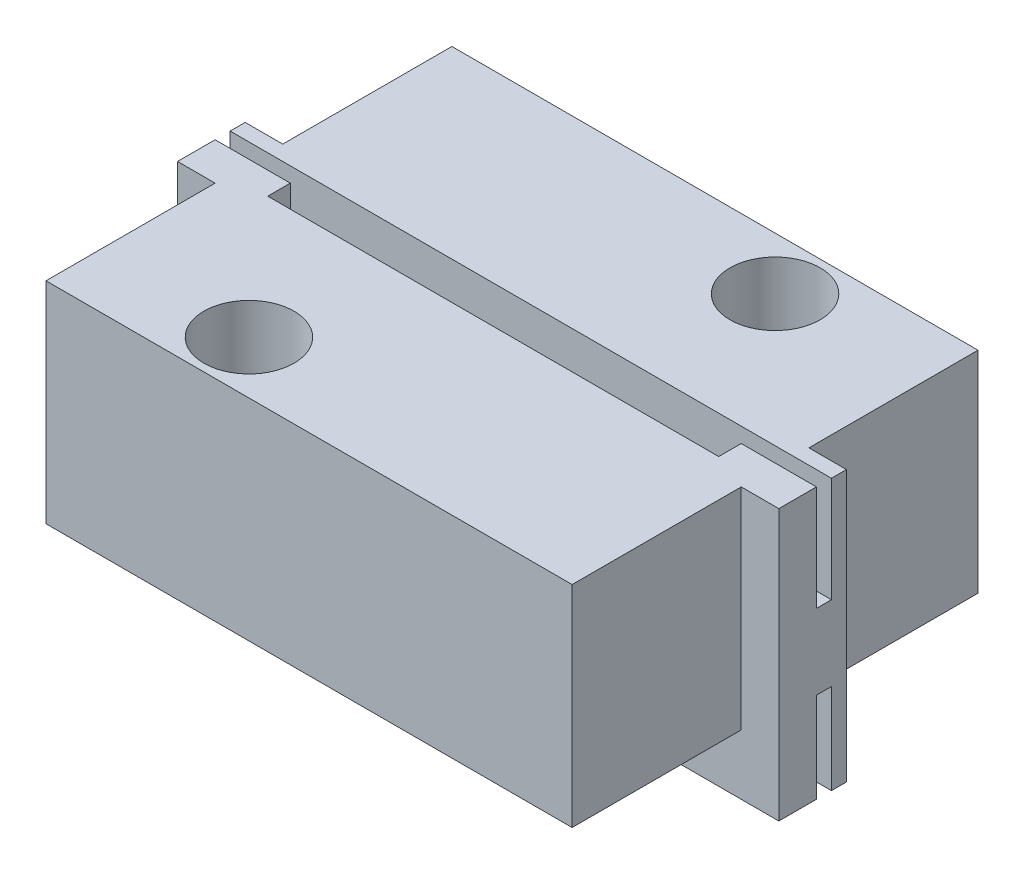
ISO-10303-21;
HEADER;
FILE_DESCRIPTION(('STEP AP214'),'2;1');
FILE_NAME('part.step','',(''),(''),'','','');
FILE_SCHEMA(('AUTOMOTIVE_DESIGN { 1 0 10303 214 1 1 1 1 }'));
ENDSEC;
DATA;
#1=APPLICATION_CONTEXT('core data for automotive mechanical design processes');
#2=APPLICATION_PROTOCOL_DEFINITION('international standard','automotive_design',2000,#1);
#3=PRODUCT_CONTEXT('',#1,'mechanical');
#4=PRODUCT('Part','Part','',(#3));
#5=PRODUCT_RELATED_PRODUCT_CATEGORY('part','',(#4));
#6=PRODUCT_DEFINITION_FORMATION('','',#4);
#7=PRODUCT_DEFINITION_CONTEXT('part definition',#1,'design');
#8=PRODUCT_DEFINITION('design','',#6,#7);
#9=PRODUCT_DEFINITION_SHAPE('','',#8);
#10=(LENGTH_UNIT() NAMED_UNIT(*) SI_UNIT(.MILLI.,.METRE.));
#11=(NAMED_UNIT(*) PLANE_ANGLE_UNIT() SI_UNIT($,.RADIAN.));
#12=(NAMED_UNIT(*) SI_UNIT($,.STERADIAN.) SOLID_ANGLE_UNIT());
#13=UNCERTAINTY_MEASURE_WITH_UNIT(LENGTH_MEASURE(1.E-05),#10,'distance_accuracy_value','');
#14=(GEOMETRIC_REPRESENTATION_CONTEXT(3) GLOBAL_UNCERTAINTY_ASSIGNED_CONTEXT((#13)) GLOBAL_UNIT_ASSIGNED_CONTEXT((#10,
#11,#12)) REPRESENTATION_CONTEXT('',''));
#15=CARTESIAN_POINT('',(0.,0.,0.));
#16=DIRECTION('',(0.,0.,1.));
#17=DIRECTION('',(1.,0.,0.));
#18=AXIS2_PLACEMENT_3D('',#15,#16,#17);
#19=CARTESIAN_POINT('',(20.,7.,1.25));
#20=DIRECTION('',(0.,0.,1.));
#21=DIRECTION('',(1.,0.,0.));
#22=AXIS2_PLACEMENT_3D('',#19,#20,#21);
#23=PLANE('',#22);
#24=DIRECTION('',(0.,-1.,0.));
#25=VECTOR('',#24,1.);
#26=CARTESIAN_POINT('',(-15.,7.,1.25));
#27=LINE('',#26,#25);
#28=CARTESIAN_POINT('',(-15.,14.,1.25));
#29=VERTEX_POINT('',#28);
#30=CARTESIAN_POINT('',(-15.,7.,1.25));
#31=VERTEX_POINT('',#30);
#32=EDGE_CURVE('E256',#29,#31,#27,.T.);
#33=ORIENTED_EDGE('',*,*,#32,.F.);
#34=DIRECTION('',(1.,0.,0.));
#35=VECTOR('',#34,1.);
#36=CARTESIAN_POINT('',(20.,14.,1.25));
#37=LINE('',#36,#35);
#38=CARTESIAN_POINT('',(15.,14.,1.25));
#39=VERTEX_POINT('',#38);
#40=EDGE_CURVE('E295',#29,#39,#37,.T.);
#41=ORIENTED_EDGE('',*,*,#40,.T.);
#42=DIRECTION('',(0.,1.,0.));
#43=VECTOR('',#42,1.);
#44=CARTESIAN_POINT('',(15.,7.,1.25));
#45=LINE('',#44,#43);
#46=CARTESIAN_POINT('',(15.,7.,1.25));
#47=VERTEX_POINT('',#46);
#48=EDGE_CURVE('E270',#47,#39,#45,.T.);
#49=ORIENTED_EDGE('',*,*,#48,.F.);
#50=DIRECTION('',(1.,0.,0.));
#51=VECTOR('',#50,1.);
#52=CARTESIAN_POINT('',(20.,7.,1.25));
#53=LINE('',#52,#51);
#54=EDGE_CURVE('E299',#31,#47,#53,.T.);
#55=ORIENTED_EDGE('',*,*,#54,.F.);
#56=EDGE_LOOP('',(#33,#41,#49,#55));
#57=FACE_BOUND('',#56,.T.);
#58=ADVANCED_FACE('F39',(#57),#23,.F.);
#59=CARTESIAN_POINT('',(0.,7.,0.));
#60=DIRECTION('',(0.,1.,0.));
#61=DIRECTION('',(0.,0.,1.));
#62=AXIS2_PLACEMENT_3D('',#59,#60,#61);
#63=PLANE('',#62);
#64=DIRECTION('',(-1.,0.,0.));
#65=VECTOR('',#64,1.);
#66=CARTESIAN_POINT('',(-20.,7.,-0.25));
#67=LINE('',#66,#65);
#68=CARTESIAN_POINT('',(-15.,7.,-0.25));
#69=VERTEX_POINT('',#68);
#70=CARTESIAN_POINT('',(-20.,7.,-0.25));
#71=VERTEX_POINT('',#70);
#72=EDGE_CURVE('E57',#69,#71,#67,.T.);
#73=ORIENTED_EDGE('',*,*,#72,.F.);
#74=DIRECTION('',(0.,0.,1.));
#75=VECTOR('',#74,1.);
#76=CARTESIAN_POINT('',(-15.,7.,-0.25));
#77=LINE('',#76,#75);
#78=EDGE_CURVE('E62',#69,#31,#77,.T.);
#79=ORIENTED_EDGE('',*,*,#78,.T.);
#80=ORIENTED_EDGE('',*,*,#54,.T.);
#81=DIRECTION('',(0.,0.,1.));
#82=VECTOR('',#81,1.);
#83=CARTESIAN_POINT('',(15.,7.,-0.25));
#84=LINE('',#83,#82);
#85=CARTESIAN_POINT('',(15.,7.,-0.25));
#86=VERTEX_POINT('',#85);
#87=EDGE_CURVE('E291',#86,#47,#84,.T.);
#88=ORIENTED_EDGE('',*,*,#87,.F.);
#89=DIRECTION('',(-1.,0.,0.));
#90=VECTOR('',#89,1.);
#91=CARTESIAN_POINT('',(20.,7.,-0.25));
#92=LINE('',#91,#90);
#93=CARTESIAN_POINT('',(20.,7.,-0.25));
#94=VERTEX_POINT('',#93);
#95=EDGE_CURVE('E274',#94,#86,#92,.T.);
#96=ORIENTED_EDGE('',*,*,#95,.F.);
#97=DIRECTION('',(0.,0.,-1.));
#98=VECTOR('',#97,1.);
#99=CARTESIAN_POINT('',(20.,7.,1.25));
#100=LINE('',#99,#98);
#101=CARTESIAN_POINT('',(20.,7.,-1.25));
#102=VERTEX_POINT('',#101);
#103=EDGE_CURVE('E303',#94,#102,#100,.T.);
#104=ORIENTED_EDGE('',*,*,#103,.T.);
#105=DIRECTION('',(-1.,0.,0.));
#106=VECTOR('',#105,1.);
#107=CARTESIAN_POINT('',(20.,7.,-1.25));
#108=LINE('',#107,#106);
#109=CARTESIAN_POINT('',(-20.,7.,-1.25));
#110=VERTEX_POINT('',#109);
#111=EDGE_CURVE('E306',#102,#110,#108,.T.);
#112=ORIENTED_EDGE('',*,*,#111,.T.);
#113=DIRECTION('',(0.,0.,1.));
#114=VECTOR('',#113,1.);
#115=CARTESIAN_POINT('',(-20.,7.,1.25));
#116=LINE('',#115,#114);
#117=EDGE_CURVE('E296',#110,#71,#116,.T.);
#118=ORIENTED_EDGE('',*,*,#117,.T.);
#119=EDGE_LOOP('',(#73,#79,#80,#88,#96,#104,#112,#118));
#120=FACE_BOUND('',#119,.T.);
#121=ADVANCED_FACE('F569',(#120),#63,.T.);
#122=CARTESIAN_POINT('',(0.,14.,0.));
#123=DIRECTION('',(0.,1.,0.));
#124=DIRECTION('',(0.,0.,1.));
#125=AXIS2_PLACEMENT_3D('',#122,#123,#124);
#126=PLANE('',#125);
#127=DIRECTION('',(-1.,0.,0.));
#128=VECTOR('',#127,1.);
#129=CARTESIAN_POINT('',(20.,14.,-1.25));
#130=LINE('',#129,#128);
#131=CARTESIAN_POINT('',(20.,14.,-1.25));
#132=VERTEX_POINT('',#131);
#133=CARTESIAN_POINT('',(-20.,14.,-1.25));
#134=VERTEX_POINT('',#133);
#135=EDGE_CURVE('E300',#132,#134,#130,.T.);
#136=ORIENTED_EDGE('',*,*,#135,.F.);
#137=DIRECTION('',(0.,0.,1.));
#138=VECTOR('',#137,1.);
#139=CARTESIAN_POINT('',(20.,14.,2.25));
#140=LINE('',#139,#138);
#141=CARTESIAN_POINT('',(20.,14.,-2.25));
#142=VERTEX_POINT('',#141);
#143=EDGE_CURVE('E376',#142,#132,#140,.T.);
#144=ORIENTED_EDGE('',*,*,#143,.F.);
#145=DIRECTION('',(-1.,0.,0.));
#146=VECTOR('',#145,1.);
#147=CARTESIAN_POINT('',(20.,14.,-2.25));
#148=LINE('',#147,#146);
#149=CARTESIAN_POINT('',(17.5,14.,-2.25));
#150=VERTEX_POINT('',#149);
#151=EDGE_CURVE('E401',#142,#150,#148,.T.);
#152=ORIENTED_EDGE('',*,*,#151,.T.);
#153=DIRECTION('',(0.,0.,-1.));
#154=VECTOR('',#153,1.);
#155=CARTESIAN_POINT('',(17.5,14.,-13.5));
#156=LINE('',#155,#154);
#157=CARTESIAN_POINT('',(17.5,14.,-13.5));
#158=VERTEX_POINT('',#157);
#159=EDGE_CURVE('E500',#150,#158,#156,.T.);
#160=ORIENTED_EDGE('',*,*,#159,.T.);
#161=DIRECTION('',(-1.,0.,0.));
#162=VECTOR('',#161,1.);
#163=CARTESIAN_POINT('',(-17.5,14.,-13.5));
#164=LINE('',#163,#162);
#165=CARTESIAN_POINT('',(-17.5,14.,-13.5));
#166=VERTEX_POINT('',#165);
#167=EDGE_CURVE('E499',#158,#166,#164,.T.);
#168=ORIENTED_EDGE('',*,*,#167,.T.);
#169=DIRECTION('',(0.,0.,1.));
#170=VECTOR('',#169,1.);
#171=CARTESIAN_POINT('',(-17.5,14.,-13.5));
#172=LINE('',#171,#170);
#173=CARTESIAN_POINT('',(-17.5,14.,-2.25));
#174=VERTEX_POINT('',#173);
#175=EDGE_CURVE('E504',#166,#174,#172,.T.);
#176=ORIENTED_EDGE('',*,*,#175,.T.);
#177=DIRECTION('',(1.,0.,0.));
#178=VECTOR('',#177,1.);
#179=CARTESIAN_POINT('',(-20.,14.,-2.25));
#180=LINE('',#179,#178);
#181=CARTESIAN_POINT('',(-20.,14.,-2.25));
#182=VERTEX_POINT('',#181);
#183=EDGE_CURVE('E426',#182,#174,#180,.T.);
#184=ORIENTED_EDGE('',*,*,#183,.F.);
#185=DIRECTION('',(0.,0.,-1.));
#186=VECTOR('',#185,1.);
#187=CARTESIAN_POINT('',(-20.,14.,2.25));
#188=LINE('',#187,#186);
#189=EDGE_CURVE('E240',#134,#182,#188,.T.);
#190=ORIENTED_EDGE('',*,*,#189,.F.);
#191=EDGE_LOOP('',(#136,#144,#152,#160,#168,#176,#184,#190));
#192=FACE_BOUND('',#191,.T.);
#193=CARTESIAN_POINT('',(7.5,14.,-10.));
#194=DIRECTION('',(0.,1.,0.));
#195=DIRECTION('',(0.,0.,1.));
#196=AXIS2_PLACEMENT_3D('',#193,#194,#195);
#197=CIRCLE('',#196,3.);
#198=CARTESIAN_POINT('',(7.5,14.,-7.));
#199=VERTEX_POINT('',#198);
#200=EDGE_CURVE('E463',#199,#199,#197,.T.);
#201=ORIENTED_EDGE('',*,*,#200,.F.);
#202=EDGE_LOOP('',(#201));
#203=FACE_BOUND('',#202,.T.);
#204=ADVANCED_FACE('F575',(#192,#203),#126,.T.);
#205=CARTESIAN_POINT('',(17.5,2.,1.25));
#206=DIRECTION('',(0.,0.,1.));
#207=DIRECTION('',(1.,0.,0.));
#208=AXIS2_PLACEMENT_3D('',#205,#206,#207);
#209=PLANE('',#208);
#210=DIRECTION('',(0.,-1.,0.));
#211=VECTOR('',#210,1.);
#212=CARTESIAN_POINT('',(-15.,2.,1.25));
#213=LINE('',#212,#211);
#214=CARTESIAN_POINT('',(-15.,2.,1.25));
#215=VERTEX_POINT('',#214);
#216=CARTESIAN_POINT('',(-15.,-4.,1.25));
#217=VERTEX_POINT('',#216);
#218=EDGE_CURVE('E319',#215,#217,#213,.T.);
#219=ORIENTED_EDGE('',*,*,#218,.F.);
#220=DIRECTION('',(-1.,0.,0.));
#221=VECTOR('',#220,1.);
#222=CARTESIAN_POINT('',(17.5,2.,1.25));
#223=LINE('',#222,#221);
#224=CARTESIAN_POINT('',(15.,2.,1.25));
#225=VERTEX_POINT('',#224);
#226=EDGE_CURVE('E445',#225,#215,#223,.T.);
#227=ORIENTED_EDGE('',*,*,#226,.F.);
#228=DIRECTION('',(0.,1.,0.));
#229=VECTOR('',#228,1.);
#230=CARTESIAN_POINT('',(15.,2.,1.25));
#231=LINE('',#230,#229);
#232=CARTESIAN_POINT('',(15.,-4.,1.25));
#233=VERTEX_POINT('',#232);
#234=EDGE_CURVE('E344',#233,#225,#231,.T.);
#235=ORIENTED_EDGE('',*,*,#234,.F.);
#236=DIRECTION('',(-1.,0.,0.));
#237=VECTOR('',#236,1.);
#238=CARTESIAN_POINT('',(17.5,-4.,1.25));
#239=LINE('',#238,#237);
#240=EDGE_CURVE('E446',#233,#217,#239,.T.);
#241=ORIENTED_EDGE('',*,*,#240,.T.);
#242=EDGE_LOOP('',(#219,#227,#235,#241));
#243=FACE_BOUND('',#242,.T.);
#244=ADVANCED_FACE('F606',(#243),#209,.F.);
#245=CARTESIAN_POINT('',(0.,2.,0.));
#246=DIRECTION('',(0.,-1.,0.));
#247=DIRECTION('',(0.,0.,-1.));
#248=AXIS2_PLACEMENT_3D('',#245,#246,#247);
#249=PLANE('',#248);
#250=ORIENTED_EDGE('',*,*,#226,.T.);
#251=DIRECTION('',(0.,0.,1.));
#252=VECTOR('',#251,1.);
#253=CARTESIAN_POINT('',(-15.,2.,-0.25));
#254=LINE('',#253,#252);
#255=CARTESIAN_POINT('',(-15.,2.,-0.25));
#256=VERTEX_POINT('',#255);
#257=EDGE_CURVE('E341',#256,#215,#254,.T.);
#258=ORIENTED_EDGE('',*,*,#257,.F.);
#259=DIRECTION('',(1.,0.,0.));
#260=VECTOR('',#259,1.);
#261=CARTESIAN_POINT('',(-20.,2.,-0.25));
#262=LINE('',#261,#260);
#263=CARTESIAN_POINT('',(-20.,2.,-0.25));
#264=VERTEX_POINT('',#263);
#265=EDGE_CURVE('E325',#264,#256,#262,.T.);
#266=ORIENTED_EDGE('',*,*,#265,.F.);
#267=DIRECTION('',(0.,0.,1.));
#268=VECTOR('',#267,1.);
#269=CARTESIAN_POINT('',(-20.,2.,1.25));
#270=LINE('',#269,#268);
#271=CARTESIAN_POINT('',(-20.,2.,-1.25));
#272=VERTEX_POINT('',#271);
#273=EDGE_CURVE('E414',#272,#264,#270,.T.);
#274=ORIENTED_EDGE('',*,*,#273,.F.);
#275=DIRECTION('',(1.,0.,0.));
#276=VECTOR('',#275,1.);
#277=CARTESIAN_POINT('',(17.5,2.,-1.25));
#278=LINE('',#277,#276);
#279=CARTESIAN_POINT('',(20.,2.,-1.25));
#280=VERTEX_POINT('',#279);
#281=EDGE_CURVE('E441',#272,#280,#278,.T.);
#282=ORIENTED_EDGE('',*,*,#281,.T.);
#283=DIRECTION('',(0.,0.,-1.));
#284=VECTOR('',#283,1.);
#285=CARTESIAN_POINT('',(20.,2.,-1.25));
#286=LINE('',#285,#284);
#287=CARTESIAN_POINT('',(20.,2.,-0.25));
#288=VERTEX_POINT('',#287);
#289=EDGE_CURVE('E387',#288,#280,#286,.T.);
#290=ORIENTED_EDGE('',*,*,#289,.F.);
#291=DIRECTION('',(1.,0.,0.));
#292=VECTOR('',#291,1.);
#293=CARTESIAN_POINT('',(20.,2.,-0.25));
#294=LINE('',#293,#292);
#295=CARTESIAN_POINT('',(15.,2.,-0.25));
#296=VERTEX_POINT('',#295);
#297=EDGE_CURVE('E355',#296,#288,#294,.T.);
#298=ORIENTED_EDGE('',*,*,#297,.F.);
#299=DIRECTION('',(0.,0.,1.));
#300=VECTOR('',#299,1.);
#301=CARTESIAN_POINT('',(15.,2.,-0.25));
#302=LINE('',#301,#300);
#303=EDGE_CURVE('E358',#296,#225,#302,.T.);
#304=ORIENTED_EDGE('',*,*,#303,.T.);
#305=EDGE_LOOP('',(#250,#258,#266,#274,#282,#290,#298,#304));
#306=FACE_BOUND('',#305,.T.);
#307=ADVANCED_FACE('F603',(#306),#249,.T.);
#308=CARTESIAN_POINT('',(17.5,14.,-13.5));
#309=DIRECTION('',(-1.,0.,0.));
#310=DIRECTION('',(0.,0.,1.));
#311=AXIS2_PLACEMENT_3D('',#308,#309,#310);
#312=PLANE('',#311);
#313=DIRECTION('',(0.,-1.,0.));
#314=VECTOR('',#313,1.);
#315=CARTESIAN_POINT('',(17.5,-4.,2.25));
#316=LINE('',#315,#314);
#317=CARTESIAN_POINT('',(17.5,14.,2.25));
#318=VERTEX_POINT('',#317);
#319=CARTESIAN_POINT('',(17.5,0.,2.25));
#320=VERTEX_POINT('',#319);
#321=EDGE_CURVE('E367',#318,#320,#316,.T.);
#322=ORIENTED_EDGE('',*,*,#321,.F.);
#323=CARTESIAN_POINT('',(17.5,14.,13.5));
#324=VERTEX_POINT('',#323);
#325=EDGE_CURVE('E495',#324,#318,#156,.T.);
#326=ORIENTED_EDGE('',*,*,#325,.F.);
#327=DIRECTION('',(0.,-1.,0.));
#328=VECTOR('',#327,1.);
#329=CARTESIAN_POINT('',(17.5,14.,13.5));
#330=LINE('',#329,#328);
#331=CARTESIAN_POINT('',(17.5,0.,13.5));
#332=VERTEX_POINT('',#331);
#333=EDGE_CURVE('E511',#324,#332,#330,.T.);
#334=ORIENTED_EDGE('',*,*,#333,.T.);
#335=DIRECTION('',(0.,0.,-1.));
#336=VECTOR('',#335,1.);
#337=CARTESIAN_POINT('',(17.5,0.,-13.5));
#338=LINE('',#337,#336);
#339=EDGE_CURVE('E512',#332,#320,#338,.T.);
#340=ORIENTED_EDGE('',*,*,#339,.T.);
#341=EDGE_LOOP('',(#322,#326,#334,#340));
#342=FACE_BOUND('',#341,.T.);
#343=ADVANCED_FACE('F41',(#342),#312,.F.);
#344=DIRECTION('',(0.,1.,0.));
#345=VECTOR('',#344,1.);
#346=CARTESIAN_POINT('',(17.5,14.,-2.25));
#347=LINE('',#346,#345);
#348=CARTESIAN_POINT('',(17.5,0.,-2.25));
#349=VERTEX_POINT('',#348);
#350=EDGE_CURVE('E11',#349,#150,#347,.T.);
#351=ORIENTED_EDGE('',*,*,#350,.F.);
#352=CARTESIAN_POINT('',(17.5,0.,-13.5));
#353=VERTEX_POINT('',#352);
#354=EDGE_CURVE('E490',#349,#353,#338,.T.);
#355=ORIENTED_EDGE('',*,*,#354,.T.);
#356=DIRECTION('',(0.,-1.,0.));
#357=VECTOR('',#356,1.);
#358=CARTESIAN_POINT('',(17.5,14.,-13.5));
#359=LINE('',#358,#357);
#360=EDGE_CURVE('E430',#158,#353,#359,.T.);
#361=ORIENTED_EDGE('',*,*,#360,.F.);
#362=ORIENTED_EDGE('',*,*,#159,.F.);
#363=EDGE_LOOP('',(#351,#355,#361,#362));
#364=FACE_BOUND('',#363,.T.);
#365=ADVANCED_FACE('F667',(#364),#312,.F.);
#366=CARTESIAN_POINT('',(-17.5,14.,-13.5));
#367=DIRECTION('',(1.,0.,0.));
#368=DIRECTION('',(0.,0.,-1.));
#369=AXIS2_PLACEMENT_3D('',#366,#367,#368);
#370=PLANE('',#369);
#371=DIRECTION('',(0.,-1.,0.));
#372=VECTOR('',#371,1.);
#373=CARTESIAN_POINT('',(-17.5,-4.,-2.25));
#374=LINE('',#373,#372);
#375=CARTESIAN_POINT('',(-17.5,0.,-2.25));
#376=VERTEX_POINT('',#375);
#377=EDGE_CURVE('E405',#174,#376,#374,.T.);
#378=ORIENTED_EDGE('',*,*,#377,.F.);
#379=ORIENTED_EDGE('',*,*,#175,.F.);
#380=DIRECTION('',(0.,-1.,0.));
#381=VECTOR('',#380,1.);
#382=CARTESIAN_POINT('',(-17.5,14.,-13.5));
#383=LINE('',#382,#381);
#384=CARTESIAN_POINT('',(-17.5,0.,-13.5));
#385=VERTEX_POINT('',#384);
#386=EDGE_CURVE('E534',#166,#385,#383,.T.);
#387=ORIENTED_EDGE('',*,*,#386,.T.);
#388=DIRECTION('',(0.,0.,1.));
#389=VECTOR('',#388,1.);
#390=CARTESIAN_POINT('',(-17.5,0.,-13.5));
#391=LINE('',#390,#389);
#392=EDGE_CURVE('E520',#385,#376,#391,.T.);
#393=ORIENTED_EDGE('',*,*,#392,.T.);
#394=EDGE_LOOP('',(#378,#379,#387,#393));
#395=FACE_BOUND('',#394,.T.);
#396=ADVANCED_FACE('F664',(#395),#370,.F.);
#397=DIRECTION('',(0.,1.,0.));
#398=VECTOR('',#397,1.);
#399=CARTESIAN_POINT('',(-17.5,0.,2.25));
#400=LINE('',#399,#398);
#401=CARTESIAN_POINT('',(-17.5,0.,2.25));
#402=VERTEX_POINT('',#401);
#403=CARTESIAN_POINT('',(-17.5,14.,2.25));
#404=VERTEX_POINT('',#403);
#405=EDGE_CURVE('E49',#402,#404,#400,.T.);
#406=ORIENTED_EDGE('',*,*,#405,.F.);
#407=CARTESIAN_POINT('',(-17.5,0.,13.5));
#408=VERTEX_POINT('',#407);
#409=EDGE_CURVE('E519',#402,#408,#391,.T.);
#410=ORIENTED_EDGE('',*,*,#409,.T.);
#411=DIRECTION('',(0.,-1.,0.));
#412=VECTOR('',#411,1.);
#413=CARTESIAN_POINT('',(-17.5,14.,13.5));
#414=LINE('',#413,#412);
#415=CARTESIAN_POINT('',(-17.5,14.,13.5));
#416=VERTEX_POINT('',#415);
#417=EDGE_CURVE('E530',#416,#408,#414,.T.);
#418=ORIENTED_EDGE('',*,*,#417,.F.);
#419=EDGE_CURVE('E503',#404,#416,#172,.T.);
#420=ORIENTED_EDGE('',*,*,#419,.F.);
#421=EDGE_LOOP('',(#406,#410,#418,#420));
#422=FACE_BOUND('',#421,.T.);
#423=ADVANCED_FACE('F666',(#422),#370,.F.);
#424=CARTESIAN_POINT('',(0.,-4.,0.));
#425=DIRECTION('',(0.,-1.,0.));
#426=DIRECTION('',(0.,0.,-1.));
#427=AXIS2_PLACEMENT_3D('',#424,#425,#426);
#428=PLANE('',#427);
#429=ORIENTED_EDGE('',*,*,#240,.F.);
#430=DIRECTION('',(0.,0.,1.));
#431=VECTOR('',#430,1.);
#432=CARTESIAN_POINT('',(15.,-4.,-0.25));
#433=LINE('',#432,#431);
#434=CARTESIAN_POINT('',(15.,-4.,-0.25));
#435=VERTEX_POINT('',#434);
#436=EDGE_CURVE('E364',#435,#233,#433,.T.);
#437=ORIENTED_EDGE('',*,*,#436,.F.);
#438=DIRECTION('',(-1.,0.,0.));
#439=VECTOR('',#438,1.);
#440=CARTESIAN_POINT('',(20.,-4.,-0.25));
#441=LINE('',#440,#439);
#442=CARTESIAN_POINT('',(20.,-4.,-0.25));
#443=VERTEX_POINT('',#442);
#444=EDGE_CURVE('E349',#443,#435,#441,.T.);
#445=ORIENTED_EDGE('',*,*,#444,.F.);
#446=DIRECTION('',(0.,0.,-1.));
#447=VECTOR('',#446,1.);
#448=CARTESIAN_POINT('',(20.,-4.,1.25));
#449=LINE('',#448,#447);
#450=CARTESIAN_POINT('',(20.,-4.,2.25));
#451=VERTEX_POINT('',#450);
#452=EDGE_CURVE('E384',#451,#443,#449,.T.);
#453=ORIENTED_EDGE('',*,*,#452,.F.);
#454=DIRECTION('',(-1.,0.,0.));
#455=VECTOR('',#454,1.);
#456=CARTESIAN_POINT('',(17.5,-4.,2.25));
#457=LINE('',#456,#455);
#458=CARTESIAN_POINT('',(-20.,-4.,2.25));
#459=VERTEX_POINT('',#458);
#460=EDGE_CURVE('E459',#451,#459,#457,.T.);
#461=ORIENTED_EDGE('',*,*,#460,.T.);
#462=DIRECTION('',(0.,0.,1.));
#463=VECTOR('',#462,1.);
#464=CARTESIAN_POINT('',(-20.,-4.,2.25));
#465=LINE('',#464,#463);
#466=CARTESIAN_POINT('',(-20.,-4.,-0.25));
#467=VERTEX_POINT('',#466);
#468=EDGE_CURVE('E418',#467,#459,#465,.T.);
#469=ORIENTED_EDGE('',*,*,#468,.F.);
#470=DIRECTION('',(-1.,0.,0.));
#471=VECTOR('',#470,1.);
#472=CARTESIAN_POINT('',(-20.,-4.,-0.25));
#473=LINE('',#472,#471);
#474=CARTESIAN_POINT('',(-15.,-4.,-0.25));
#475=VERTEX_POINT('',#474);
#476=EDGE_CURVE('E331',#475,#467,#473,.T.);
#477=ORIENTED_EDGE('',*,*,#476,.F.);
#478=DIRECTION('',(0.,0.,1.));
#479=VECTOR('',#478,1.);
#480=CARTESIAN_POINT('',(-15.,-4.,-0.25));
#481=LINE('',#480,#479);
#482=EDGE_CURVE('E335',#475,#217,#481,.T.);
#483=ORIENTED_EDGE('',*,*,#482,.T.);
#484=EDGE_LOOP('',(#429,#437,#445,#453,#461,#469,#477,#483));
#485=FACE_BOUND('',#484,.T.);
#486=ADVANCED_FACE('F619',(#485),#428,.T.);
#487=CARTESIAN_POINT('',(0.,0.,0.));
#488=DIRECTION('',(0.,1.,0.));
#489=DIRECTION('',(0.,0.,1.));
#490=AXIS2_PLACEMENT_3D('',#487,#488,#489);
#491=PLANE('',#490);
#492=CARTESIAN_POINT('',(-7.50000000000001,0.,10.));
#493=DIRECTION('',(0.,1.,0.));
#494=DIRECTION('',(0.,0.,1.));
#495=AXIS2_PLACEMENT_3D('',#492,#493,#494);
#496=CIRCLE('',#495,1.75);
#497=CARTESIAN_POINT('',(-7.50000000000001,0.,11.75));
#498=VERTEX_POINT('',#497);
#499=EDGE_CURVE('E491',#498,#498,#496,.T.);
#500=ORIENTED_EDGE('',*,*,#499,.T.);
#501=EDGE_LOOP('',(#500));
#502=FACE_BOUND('',#501,.T.);
#503=DIRECTION('',(-1.,0.,0.));
#504=VECTOR('',#503,1.);
#505=CARTESIAN_POINT('',(17.5,0.,2.25));
#506=LINE('',#505,#504);
#507=EDGE_CURVE('E460',#320,#402,#506,.T.);
#508=ORIENTED_EDGE('',*,*,#507,.F.);
#509=ORIENTED_EDGE('',*,*,#339,.F.);
#510=DIRECTION('',(1.,0.,0.));
#511=VECTOR('',#510,1.);
#512=CARTESIAN_POINT('',(-17.5,0.,13.5));
#513=LINE('',#512,#511);
#514=EDGE_CURVE('E524',#408,#332,#513,.T.);
#515=ORIENTED_EDGE('',*,*,#514,.F.);
#516=ORIENTED_EDGE('',*,*,#409,.F.);
#517=EDGE_LOOP('',(#508,#509,#515,#516));
#518=FACE_BOUND('',#517,.T.);
#519=ADVANCED_FACE('F563',(#502,#518),#491,.F.);
#520=CARTESIAN_POINT('',(7.5,0.,-10.));
#521=DIRECTION('',(0.,1.,0.));
#522=DIRECTION('',(0.,0.,1.));
#523=AXIS2_PLACEMENT_3D('',#520,#521,#522);
#524=CIRCLE('',#523,1.75);
#525=CARTESIAN_POINT('',(7.5,0.,-8.25));
#526=VERTEX_POINT('',#525);
#527=EDGE_CURVE('E486',#526,#526,#524,.T.);
#528=ORIENTED_EDGE('',*,*,#527,.T.);
#529=EDGE_LOOP('',(#528));
#530=FACE_BOUND('',#529,.T.);
#531=DIRECTION('',(1.,0.,0.));
#532=VECTOR('',#531,1.);
#533=CARTESIAN_POINT('',(17.5,0.,-2.25));
#534=LINE('',#533,#532);
#535=EDGE_CURVE('E450',#376,#349,#534,.T.);
#536=ORIENTED_EDGE('',*,*,#535,.F.);
#537=ORIENTED_EDGE('',*,*,#392,.F.);
#538=DIRECTION('',(-1.,0.,0.));
#539=VECTOR('',#538,1.);
#540=CARTESIAN_POINT('',(-17.5,0.,-13.5));
#541=LINE('',#540,#539);
#542=EDGE_CURVE('E516',#353,#385,#541,.T.);
#543=ORIENTED_EDGE('',*,*,#542,.F.);
#544=ORIENTED_EDGE('',*,*,#354,.F.);
#545=EDGE_LOOP('',(#536,#537,#543,#544));
#546=FACE_BOUND('',#545,.T.);
#547=ADVANCED_FACE('F553',(#530,#546),#491,.F.);
#548=CARTESIAN_POINT('',(-7.50000000000001,0.,10.));
#549=DIRECTION('',(0.,1.,0.));
#550=DIRECTION('',(0.,0.,1.));
#551=AXIS2_PLACEMENT_3D('',#548,#549,#550);
#552=CYLINDRICAL_SURFACE('',#551,1.75);
#553=ORIENTED_EDGE('',*,*,#499,.F.);
#554=EDGE_LOOP('',(#553));
#555=FACE_BOUND('',#554,.T.);
#556=CARTESIAN_POINT('',(-7.50000000000001,4.,10.));
#557=DIRECTION('',(0.,1.,0.));
#558=DIRECTION('',(0.,0.,1.));
#559=AXIS2_PLACEMENT_3D('',#556,#557,#558);
#560=CIRCLE('',#559,1.75);
#561=CARTESIAN_POINT('',(-7.50000000000001,4.,11.75));
#562=VERTEX_POINT('',#561);
#563=EDGE_CURVE('E43',#562,#562,#560,.F.);
#564=ORIENTED_EDGE('',*,*,#563,.F.);
#565=EDGE_LOOP('',(#564));
#566=FACE_BOUND('',#565,.T.);
#567=ADVANCED_FACE('F550',(#555,#566),#552,.F.);
#568=CARTESIAN_POINT('',(7.5,0.,-10.));
#569=DIRECTION('',(0.,1.,0.));
#570=DIRECTION('',(0.,0.,1.));
#571=AXIS2_PLACEMENT_3D('',#568,#569,#570);
#572=CYLINDRICAL_SURFACE('',#571,1.75);
#573=ORIENTED_EDGE('',*,*,#527,.F.);
#574=EDGE_LOOP('',(#573));
#575=FACE_BOUND('',#574,.T.);
#576=CARTESIAN_POINT('',(7.5,4.,-10.));
#577=DIRECTION('',(0.,1.,0.));
#578=DIRECTION('',(0.,0.,1.));
#579=AXIS2_PLACEMENT_3D('',#576,#577,#578);
#580=CIRCLE('',#579,1.75);
#581=CARTESIAN_POINT('',(7.5,4.,-8.25));
#582=VERTEX_POINT('',#581);
#583=EDGE_CURVE('E474',#582,#582,#580,.F.);
#584=ORIENTED_EDGE('',*,*,#583,.F.);
#585=EDGE_LOOP('',(#584));
#586=FACE_BOUND('',#585,.T.);
#587=ADVANCED_FACE('F552',(#575,#586),#572,.F.);
#588=CARTESIAN_POINT('',(-17.5,14.,-13.5));
#589=DIRECTION('',(0.,0.,1.));
#590=DIRECTION('',(1.,0.,0.));
#591=AXIS2_PLACEMENT_3D('',#588,#589,#590);
#592=PLANE('',#591);
#593=ORIENTED_EDGE('',*,*,#542,.T.);
#594=ORIENTED_EDGE('',*,*,#386,.F.);
#595=ORIENTED_EDGE('',*,*,#167,.F.);
#596=ORIENTED_EDGE('',*,*,#360,.T.);
#597=EDGE_LOOP('',(#593,#594,#595,#596));
#598=FACE_BOUND('',#597,.T.);
#599=ADVANCED_FACE('F560',(#598),#592,.F.);
#600=CARTESIAN_POINT('',(-17.5,14.,13.5));
#601=DIRECTION('',(0.,0.,-1.));
#602=DIRECTION('',(-1.,0.,0.));
#603=AXIS2_PLACEMENT_3D('',#600,#601,#602);
#604=PLANE('',#603);
#605=ORIENTED_EDGE('',*,*,#514,.T.);
#606=ORIENTED_EDGE('',*,*,#333,.F.);
#607=DIRECTION('',(1.,0.,0.));
#608=VECTOR('',#607,1.);
#609=CARTESIAN_POINT('',(-17.5,14.,13.5));
#610=LINE('',#609,#608);
#611=EDGE_CURVE('E508',#416,#324,#610,.T.);
#612=ORIENTED_EDGE('',*,*,#611,.F.);
#613=ORIENTED_EDGE('',*,*,#417,.T.);
#614=EDGE_LOOP('',(#605,#606,#612,#613));
#615=FACE_BOUND('',#614,.T.);
#616=ADVANCED_FACE('F653',(#615),#604,.F.);
#617=ORIENTED_EDGE('',*,*,#40,.F.);
#618=DIRECTION('',(0.,0.,1.));
#619=VECTOR('',#618,1.);
#620=CARTESIAN_POINT('',(-15.,14.,-0.25));
#621=LINE('',#620,#619);
#622=CARTESIAN_POINT('',(-15.,14.,-0.25));
#623=VERTEX_POINT('',#622);
#624=EDGE_CURVE('E248',#623,#29,#621,.T.);
#625=ORIENTED_EDGE('',*,*,#624,.F.);
#626=DIRECTION('',(1.,0.,0.));
#627=VECTOR('',#626,1.);
#628=CARTESIAN_POINT('',(-20.,14.,-0.25));
#629=LINE('',#628,#627);
#630=CARTESIAN_POINT('',(-20.,14.,-0.25));
#631=VERTEX_POINT('',#630);
#632=EDGE_CURVE('E243',#631,#623,#629,.T.);
#633=ORIENTED_EDGE('',*,*,#632,.F.);
#634=CARTESIAN_POINT('',(-20.,14.,2.25));
#635=VERTEX_POINT('',#634);
#636=EDGE_CURVE('E226',#635,#631,#188,.T.);
#637=ORIENTED_EDGE('',*,*,#636,.F.);
#638=DIRECTION('',(1.,0.,0.));
#639=VECTOR('',#638,1.);
#640=CARTESIAN_POINT('',(-20.,14.,2.25));
#641=LINE('',#640,#639);
#642=EDGE_CURVE('E437',#635,#404,#641,.T.);
#643=ORIENTED_EDGE('',*,*,#642,.T.);
#644=ORIENTED_EDGE('',*,*,#419,.T.);
#645=ORIENTED_EDGE('',*,*,#611,.T.);
#646=ORIENTED_EDGE('',*,*,#325,.T.);
#647=DIRECTION('',(-1.,0.,0.));
#648=VECTOR('',#647,1.);
#649=CARTESIAN_POINT('',(20.,14.,2.25));
#650=LINE('',#649,#648);
#651=CARTESIAN_POINT('',(20.,14.,2.25));
#652=VERTEX_POINT('',#651);
#653=EDGE_CURVE('E393',#652,#318,#650,.T.);
#654=ORIENTED_EDGE('',*,*,#653,.F.);
#655=CARTESIAN_POINT('',(20.,14.,-0.25));
#656=VERTEX_POINT('',#655);
#657=EDGE_CURVE('E375',#656,#652,#140,.T.);
#658=ORIENTED_EDGE('',*,*,#657,.F.);
#659=DIRECTION('',(1.,0.,0.));
#660=VECTOR('',#659,1.);
#661=CARTESIAN_POINT('',(20.,14.,-0.25));
#662=LINE('',#661,#660);
#663=CARTESIAN_POINT('',(15.,14.,-0.25));
#664=VERTEX_POINT('',#663);
#665=EDGE_CURVE('E280',#664,#656,#662,.T.);
#666=ORIENTED_EDGE('',*,*,#665,.F.);
#667=DIRECTION('',(0.,0.,1.));
#668=VECTOR('',#667,1.);
#669=CARTESIAN_POINT('',(15.,14.,-0.25));
#670=LINE('',#669,#668);
#671=EDGE_CURVE('E284',#664,#39,#670,.T.);
#672=ORIENTED_EDGE('',*,*,#671,.T.);
#673=EDGE_LOOP('',(#617,#625,#633,#637,#643,#644,#645,#646,#654,#658,#666,#672));
#674=FACE_BOUND('',#673,.T.);
#675=CARTESIAN_POINT('',(-7.50000000000001,14.,10.));
#676=DIRECTION('',(0.,1.,0.));
#677=DIRECTION('',(0.,0.,1.));
#678=AXIS2_PLACEMENT_3D('',#675,#676,#677);
#679=CIRCLE('',#678,3.);
#680=CARTESIAN_POINT('',(-7.50000000000001,14.,13.));
#681=VERTEX_POINT('',#680);
#682=EDGE_CURVE('E475',#681,#681,#679,.T.);
#683=ORIENTED_EDGE('',*,*,#682,.F.);
#684=EDGE_LOOP('',(#683));
#685=FACE_BOUND('',#684,.T.);
#686=ADVANCED_FACE('F245',(#674,#685),#126,.T.);
#687=CARTESIAN_POINT('',(7.5,4.,-10.));
#688=DIRECTION('',(0.,1.,0.));
#689=DIRECTION('',(0.,0.,1.));
#690=AXIS2_PLACEMENT_3D('',#687,#688,#689);
#691=PLANE('',#690);
#692=CARTESIAN_POINT('',(7.5,4.,-10.));
#693=DIRECTION('',(0.,1.,0.));
#694=DIRECTION('',(0.,0.,1.));
#695=AXIS2_PLACEMENT_3D('',#692,#693,#694);
#696=CIRCLE('',#695,3.);
#697=CARTESIAN_POINT('',(7.5,4.,-7.));
#698=VERTEX_POINT('',#697);
#699=EDGE_CURVE('E479',#698,#698,#696,.T.);
#700=ORIENTED_EDGE('',*,*,#699,.T.);
#701=EDGE_LOOP('',(#700));
#702=FACE_BOUND('',#701,.T.);
#703=ORIENTED_EDGE('',*,*,#583,.T.);
#704=EDGE_LOOP('',(#703));
#705=FACE_BOUND('',#704,.T.);
#706=ADVANCED_FACE('F635',(#702,#705),#691,.T.);
#707=CARTESIAN_POINT('',(7.5,4.,-10.));
#708=DIRECTION('',(0.,1.,0.));
#709=DIRECTION('',(0.,0.,1.));
#710=AXIS2_PLACEMENT_3D('',#707,#708,#709);
#711=CYLINDRICAL_SURFACE('',#710,3.);
#712=ORIENTED_EDGE('',*,*,#699,.F.);
#713=EDGE_LOOP('',(#712));
#714=FACE_BOUND('',#713,.T.);
#715=ORIENTED_EDGE('',*,*,#200,.T.);
#716=EDGE_LOOP('',(#715));
#717=FACE_BOUND('',#716,.T.);
#718=ADVANCED_FACE('F630',(#714,#717),#711,.F.);
#719=CARTESIAN_POINT('',(-7.50000000000001,4.,10.));
#720=DIRECTION('',(0.,1.,0.));
#721=DIRECTION('',(0.,0.,1.));
#722=AXIS2_PLACEMENT_3D('',#719,#720,#721);
#723=PLANE('',#722);
#724=CARTESIAN_POINT('',(-7.50000000000001,4.,10.));
#725=DIRECTION('',(0.,1.,0.));
#726=DIRECTION('',(0.,0.,1.));
#727=AXIS2_PLACEMENT_3D('',#724,#725,#726);
#728=CIRCLE('',#727,3.);
#729=CARTESIAN_POINT('',(-7.50000000000001,4.,13.));
#730=VERTEX_POINT('',#729);
#731=EDGE_CURVE('E470',#730,#730,#728,.T.);
#732=ORIENTED_EDGE('',*,*,#731,.T.);
#733=EDGE_LOOP('',(#732));
#734=FACE_BOUND('',#733,.T.);
#735=ORIENTED_EDGE('',*,*,#563,.T.);
#736=EDGE_LOOP('',(#735));
#737=FACE_BOUND('',#736,.T.);
#738=ADVANCED_FACE('F548',(#734,#737),#723,.T.);
#739=CARTESIAN_POINT('',(-7.50000000000001,4.,10.));
#740=DIRECTION('',(0.,1.,0.));
#741=DIRECTION('',(0.,0.,1.));
#742=AXIS2_PLACEMENT_3D('',#739,#740,#741);
#743=CYLINDRICAL_SURFACE('',#742,3.);
#744=ORIENTED_EDGE('',*,*,#731,.F.);
#745=EDGE_LOOP('',(#744));
#746=FACE_BOUND('',#745,.T.);
#747=ORIENTED_EDGE('',*,*,#682,.T.);
#748=EDGE_LOOP('',(#747));
#749=FACE_BOUND('',#748,.T.);
#750=ADVANCED_FACE('F626',(#746,#749),#743,.F.);
#751=CARTESIAN_POINT('',(17.5,-4.,-2.25));
#752=DIRECTION('',(0.,0.,1.));
#753=DIRECTION('',(1.,0.,0.));
#754=AXIS2_PLACEMENT_3D('',#751,#752,#753);
#755=PLANE('',#754);
#756=ORIENTED_EDGE('',*,*,#535,.T.);
#757=ORIENTED_EDGE('',*,*,#350,.T.);
#758=ORIENTED_EDGE('',*,*,#151,.F.);
#759=DIRECTION('',(0.,1.,0.));
#760=VECTOR('',#759,1.);
#761=CARTESIAN_POINT('',(20.,-4.,-2.25));
#762=LINE('',#761,#760);
#763=CARTESIAN_POINT('',(20.,-4.,-2.25));
#764=VERTEX_POINT('',#763);
#765=EDGE_CURVE('E372',#764,#142,#762,.T.);
#766=ORIENTED_EDGE('',*,*,#765,.F.);
#767=DIRECTION('',(1.,0.,0.));
#768=VECTOR('',#767,1.);
#769=CARTESIAN_POINT('',(17.5,-4.,-2.25));
#770=LINE('',#769,#768);
#771=CARTESIAN_POINT('',(-20.,-4.,-2.25));
#772=VERTEX_POINT('',#771);
#773=EDGE_CURVE('E456',#772,#764,#770,.T.);
#774=ORIENTED_EDGE('',*,*,#773,.F.);
#775=DIRECTION('',(0.,-1.,0.));
#776=VECTOR('',#775,1.);
#777=CARTESIAN_POINT('',(-20.,0.,-2.25));
#778=LINE('',#777,#776);
#779=EDGE_CURVE('E239',#182,#772,#778,.T.);
#780=ORIENTED_EDGE('',*,*,#779,.F.);
#781=ORIENTED_EDGE('',*,*,#183,.T.);
#782=ORIENTED_EDGE('',*,*,#377,.T.);
#783=EDGE_LOOP('',(#756,#757,#758,#766,#774,#780,#781,#782));
#784=FACE_BOUND('',#783,.T.);
#785=ADVANCED_FACE('F622',(#784),#755,.F.);
#786=CARTESIAN_POINT('',(17.5,-4.,2.25));
#787=DIRECTION('',(0.,0.,-1.));
#788=DIRECTION('',(-1.,0.,0.));
#789=AXIS2_PLACEMENT_3D('',#786,#787,#788);
#790=PLANE('',#789);
#791=ORIENTED_EDGE('',*,*,#507,.T.);
#792=ORIENTED_EDGE('',*,*,#405,.T.);
#793=ORIENTED_EDGE('',*,*,#642,.F.);
#794=DIRECTION('',(0.,1.,0.));
#795=VECTOR('',#794,1.);
#796=CARTESIAN_POINT('',(-20.,-4.,2.25));
#797=LINE('',#796,#795);
#798=EDGE_CURVE('E234',#459,#635,#797,.T.);
#799=ORIENTED_EDGE('',*,*,#798,.F.);
#800=ORIENTED_EDGE('',*,*,#460,.F.);
#801=DIRECTION('',(0.,-1.,0.));
#802=VECTOR('',#801,1.);
#803=CARTESIAN_POINT('',(20.,0.,2.25));
#804=LINE('',#803,#802);
#805=EDGE_CURVE('E380',#652,#451,#804,.T.);
#806=ORIENTED_EDGE('',*,*,#805,.F.);
#807=ORIENTED_EDGE('',*,*,#653,.T.);
#808=ORIENTED_EDGE('',*,*,#321,.T.);
#809=EDGE_LOOP('',(#791,#792,#793,#799,#800,#806,#807,#808));
#810=FACE_BOUND('',#809,.T.);
#811=ADVANCED_FACE('F617',(#810),#790,.F.);
#812=DIRECTION('',(1.,0.,0.));
#813=VECTOR('',#812,1.);
#814=CARTESIAN_POINT('',(17.5,-4.,-1.25));
#815=LINE('',#814,#813);
#816=CARTESIAN_POINT('',(-20.,-4.,-1.25));
#817=VERTEX_POINT('',#816);
#818=CARTESIAN_POINT('',(20.,-4.,-1.25));
#819=VERTEX_POINT('',#818);
#820=EDGE_CURVE('E440',#817,#819,#815,.T.);
#821=ORIENTED_EDGE('',*,*,#820,.F.);
#822=DIRECTION('',(0.,0.,1.));
#823=VECTOR('',#822,1.);
#824=CARTESIAN_POINT('',(-20.,-4.,-1.25));
#825=LINE('',#824,#823);
#826=EDGE_CURVE('E406',#772,#817,#825,.T.);
#827=ORIENTED_EDGE('',*,*,#826,.F.);
#828=ORIENTED_EDGE('',*,*,#773,.T.);
#829=DIRECTION('',(0.,0.,-1.));
#830=VECTOR('',#829,1.);
#831=CARTESIAN_POINT('',(20.,-4.,-2.25));
#832=LINE('',#831,#830);
#833=EDGE_CURVE('E368',#819,#764,#832,.T.);
#834=ORIENTED_EDGE('',*,*,#833,.F.);
#835=EDGE_LOOP('',(#821,#827,#828,#834));
#836=FACE_BOUND('',#835,.T.);
#837=ADVANCED_FACE('F613',(#836),#428,.T.);
#838=CARTESIAN_POINT('',(17.5,2.,-1.25));
#839=DIRECTION('',(0.,0.,-1.));
#840=DIRECTION('',(-1.,0.,0.));
#841=AXIS2_PLACEMENT_3D('',#838,#839,#840);
#842=PLANE('',#841);
#843=ORIENTED_EDGE('',*,*,#820,.T.);
#844=DIRECTION('',(0.,-1.,0.));
#845=VECTOR('',#844,1.);
#846=CARTESIAN_POINT('',(20.,2.,-1.25));
#847=LINE('',#846,#845);
#848=EDGE_CURVE('E390',#280,#819,#847,.T.);
#849=ORIENTED_EDGE('',*,*,#848,.F.);
#850=ORIENTED_EDGE('',*,*,#281,.F.);
#851=DIRECTION('',(0.,1.,0.));
#852=VECTOR('',#851,1.);
#853=CARTESIAN_POINT('',(-20.,2.,-1.25));
#854=LINE('',#853,#852);
#855=EDGE_CURVE('E410',#817,#272,#854,.T.);
#856=ORIENTED_EDGE('',*,*,#855,.F.);
#857=EDGE_LOOP('',(#843,#849,#850,#856));
#858=FACE_BOUND('',#857,.T.);
#859=ADVANCED_FACE('F602',(#858),#842,.F.);
#860=CARTESIAN_POINT('',(-20.,0.,0.));
#861=DIRECTION('',(1.,0.,0.));
#862=DIRECTION('',(0.,0.,-1.));
#863=AXIS2_PLACEMENT_3D('',#860,#861,#862);
#864=PLANE('',#863);
#865=ORIENTED_EDGE('',*,*,#117,.F.);
#866=DIRECTION('',(0.,1.,0.));
#867=VECTOR('',#866,1.);
#868=CARTESIAN_POINT('',(-20.,7.,-1.25));
#869=LINE('',#868,#867);
#870=EDGE_CURVE('E315',#110,#134,#869,.T.);
#871=ORIENTED_EDGE('',*,*,#870,.T.);
#872=ORIENTED_EDGE('',*,*,#189,.T.);
#873=ORIENTED_EDGE('',*,*,#779,.T.);
#874=ORIENTED_EDGE('',*,*,#826,.T.);
#875=ORIENTED_EDGE('',*,*,#855,.T.);
#876=ORIENTED_EDGE('',*,*,#273,.T.);
#877=DIRECTION('',(0.,1.,0.));
#878=VECTOR('',#877,1.);
#879=CARTESIAN_POINT('',(-20.,2.,-0.25));
#880=LINE('',#879,#878);
#881=EDGE_CURVE('E322',#467,#264,#880,.T.);
#882=ORIENTED_EDGE('',*,*,#881,.F.);
#883=ORIENTED_EDGE('',*,*,#468,.T.);
#884=ORIENTED_EDGE('',*,*,#798,.T.);
#885=ORIENTED_EDGE('',*,*,#636,.T.);
#886=DIRECTION('',(0.,1.,0.));
#887=VECTOR('',#886,1.);
#888=CARTESIAN_POINT('',(-20.,7.,-0.25));
#889=LINE('',#888,#887);
#890=EDGE_CURVE('E231',#71,#631,#889,.T.);
#891=ORIENTED_EDGE('',*,*,#890,.F.);
#892=EDGE_LOOP('',(#865,#871,#872,#873,#874,#875,#876,#882,#883,#884,#885,#891));
#893=FACE_BOUND('',#892,.T.);
#894=ADVANCED_FACE('F229',(#893),#864,.F.);
#895=CARTESIAN_POINT('',(20.,0.,0.));
#896=DIRECTION('',(1.,0.,0.));
#897=DIRECTION('',(0.,0.,-1.));
#898=AXIS2_PLACEMENT_3D('',#895,#896,#897);
#899=PLANE('',#898);
#900=DIRECTION('',(0.,-1.,0.));
#901=VECTOR('',#900,1.);
#902=CARTESIAN_POINT('',(20.,7.,-0.25));
#903=LINE('',#902,#901);
#904=EDGE_CURVE('E271',#656,#94,#903,.T.);
#905=ORIENTED_EDGE('',*,*,#904,.F.);
#906=ORIENTED_EDGE('',*,*,#657,.T.);
#907=ORIENTED_EDGE('',*,*,#805,.T.);
#908=ORIENTED_EDGE('',*,*,#452,.T.);
#909=DIRECTION('',(0.,-1.,0.));
#910=VECTOR('',#909,1.);
#911=CARTESIAN_POINT('',(20.,2.,-0.25));
#912=LINE('',#911,#910);
#913=EDGE_CURVE('E345',#288,#443,#912,.T.);
#914=ORIENTED_EDGE('',*,*,#913,.F.);
#915=ORIENTED_EDGE('',*,*,#289,.T.);
#916=ORIENTED_EDGE('',*,*,#848,.T.);
#917=ORIENTED_EDGE('',*,*,#833,.T.);
#918=ORIENTED_EDGE('',*,*,#765,.T.);
#919=ORIENTED_EDGE('',*,*,#143,.T.);
#920=DIRECTION('',(0.,1.,0.));
#921=VECTOR('',#920,1.);
#922=CARTESIAN_POINT('',(20.,7.,-1.25));
#923=LINE('',#922,#921);
#924=EDGE_CURVE('E310',#102,#132,#923,.T.);
#925=ORIENTED_EDGE('',*,*,#924,.F.);
#926=ORIENTED_EDGE('',*,*,#103,.F.);
#927=EDGE_LOOP('',(#905,#906,#907,#908,#914,#915,#916,#917,#918,#919,#925,#926));
#928=FACE_BOUND('',#927,.T.);
#929=ADVANCED_FACE('F595',(#928),#899,.T.);
#930=CARTESIAN_POINT('',(15.,2.,-0.25));
#931=DIRECTION('',(1.,0.,0.));
#932=DIRECTION('',(0.,0.,-1.));
#933=AXIS2_PLACEMENT_3D('',#930,#931,#932);
#934=PLANE('',#933);
#935=ORIENTED_EDGE('',*,*,#234,.T.);
#936=ORIENTED_EDGE('',*,*,#303,.F.);
#937=DIRECTION('',(0.,1.,0.));
#938=VECTOR('',#937,1.);
#939=CARTESIAN_POINT('',(15.,2.,-0.25));
#940=LINE('',#939,#938);
#941=EDGE_CURVE('E352',#435,#296,#940,.T.);
#942=ORIENTED_EDGE('',*,*,#941,.F.);
#943=ORIENTED_EDGE('',*,*,#436,.T.);
#944=EDGE_LOOP('',(#935,#936,#942,#943));
#945=FACE_BOUND('',#944,.T.);
#946=ADVANCED_FACE('F591',(#945),#934,.F.);
#947=CARTESIAN_POINT('',(0.,0.,-0.25));
#948=DIRECTION('',(0.,0.,-1.));
#949=DIRECTION('',(-1.,0.,0.));
#950=AXIS2_PLACEMENT_3D('',#947,#948,#949);
#951=PLANE('',#950);
#952=ORIENTED_EDGE('',*,*,#913,.T.);
#953=ORIENTED_EDGE('',*,*,#444,.T.);
#954=ORIENTED_EDGE('',*,*,#941,.T.);
#955=ORIENTED_EDGE('',*,*,#297,.T.);
#956=EDGE_LOOP('',(#952,#953,#954,#955));
#957=FACE_BOUND('',#956,.T.);
#958=ADVANCED_FACE('F587',(#957),#951,.T.);
#959=CARTESIAN_POINT('',(-15.,2.,-0.25));
#960=DIRECTION('',(-1.,0.,0.));
#961=DIRECTION('',(0.,0.,1.));
#962=AXIS2_PLACEMENT_3D('',#959,#960,#961);
#963=PLANE('',#962);
#964=ORIENTED_EDGE('',*,*,#218,.T.);
#965=ORIENTED_EDGE('',*,*,#482,.F.);
#966=DIRECTION('',(0.,-1.,0.));
#967=VECTOR('',#966,1.);
#968=CARTESIAN_POINT('',(-15.,2.,-0.25));
#969=LINE('',#968,#967);
#970=EDGE_CURVE('E328',#256,#475,#969,.T.);
#971=ORIENTED_EDGE('',*,*,#970,.F.);
#972=ORIENTED_EDGE('',*,*,#257,.T.);
#973=EDGE_LOOP('',(#964,#965,#971,#972));
#974=FACE_BOUND('',#973,.T.);
#975=ADVANCED_FACE('F583',(#974),#963,.F.);
#976=CARTESIAN_POINT('',(0.,0.,-0.25));
#977=DIRECTION('',(0.,0.,1.));
#978=DIRECTION('',(1.,0.,0.));
#979=AXIS2_PLACEMENT_3D('',#976,#977,#978);
#980=PLANE('',#979);
#981=ORIENTED_EDGE('',*,*,#881,.T.);
#982=ORIENTED_EDGE('',*,*,#265,.T.);
#983=ORIENTED_EDGE('',*,*,#970,.T.);
#984=ORIENTED_EDGE('',*,*,#476,.T.);
#985=EDGE_LOOP('',(#981,#982,#983,#984));
#986=FACE_BOUND('',#985,.T.);
#987=ADVANCED_FACE('F580',(#986),#980,.F.);
#988=CARTESIAN_POINT('',(20.,7.,-1.25));
#989=DIRECTION('',(0.,0.,-1.));
#990=DIRECTION('',(-1.,0.,0.));
#991=AXIS2_PLACEMENT_3D('',#988,#989,#990);
#992=PLANE('',#991);
#993=ORIENTED_EDGE('',*,*,#135,.T.);
#994=ORIENTED_EDGE('',*,*,#870,.F.);
#995=ORIENTED_EDGE('',*,*,#111,.F.);
#996=ORIENTED_EDGE('',*,*,#924,.T.);
#997=EDGE_LOOP('',(#993,#994,#995,#996));
#998=FACE_BOUND('',#997,.T.);
#999=ADVANCED_FACE('F579',(#998),#992,.F.);
#1000=CARTESIAN_POINT('',(15.,7.,-0.25));
#1001=DIRECTION('',(1.,0.,0.));
#1002=DIRECTION('',(0.,0.,-1.));
#1003=AXIS2_PLACEMENT_3D('',#1000,#1001,#1002);
#1004=PLANE('',#1003);
#1005=ORIENTED_EDGE('',*,*,#48,.T.);
#1006=ORIENTED_EDGE('',*,*,#671,.F.);
#1007=DIRECTION('',(0.,1.,0.));
#1008=VECTOR('',#1007,1.);
#1009=CARTESIAN_POINT('',(15.,7.,-0.25));
#1010=LINE('',#1009,#1008);
#1011=EDGE_CURVE('E277',#86,#664,#1010,.T.);
#1012=ORIENTED_EDGE('',*,*,#1011,.F.);
#1013=ORIENTED_EDGE('',*,*,#87,.T.);
#1014=EDGE_LOOP('',(#1005,#1006,#1012,#1013));
#1015=FACE_BOUND('',#1014,.T.);
#1016=ADVANCED_FACE('F733',(#1015),#1004,.F.);
#1017=CARTESIAN_POINT('',(0.,0.,-0.25));
#1018=DIRECTION('',(0.,0.,1.));
#1019=DIRECTION('',(1.,0.,0.));
#1020=AXIS2_PLACEMENT_3D('',#1017,#1018,#1019);
#1021=PLANE('',#1020);
#1022=ORIENTED_EDGE('',*,*,#904,.T.);
#1023=ORIENTED_EDGE('',*,*,#95,.T.);
#1024=ORIENTED_EDGE('',*,*,#1011,.T.);
#1025=ORIENTED_EDGE('',*,*,#665,.T.);
#1026=EDGE_LOOP('',(#1022,#1023,#1024,#1025));
#1027=FACE_BOUND('',#1026,.T.);
#1028=ADVANCED_FACE('F727',(#1027),#1021,.F.);
#1029=CARTESIAN_POINT('',(-15.,7.,-0.25));
#1030=DIRECTION('',(-1.,0.,0.));
#1031=DIRECTION('',(0.,0.,1.));
#1032=AXIS2_PLACEMENT_3D('',#1029,#1030,#1031);
#1033=PLANE('',#1032);
#1034=ORIENTED_EDGE('',*,*,#32,.T.);
#1035=ORIENTED_EDGE('',*,*,#78,.F.);
#1036=DIRECTION('',(0.,-1.,0.));
#1037=VECTOR('',#1036,1.);
#1038=CARTESIAN_POINT('',(-15.,7.,-0.25));
#1039=LINE('',#1038,#1037);
#1040=EDGE_CURVE('E252',#623,#69,#1039,.T.);
#1041=ORIENTED_EDGE('',*,*,#1040,.F.);
#1042=ORIENTED_EDGE('',*,*,#624,.T.);
#1043=EDGE_LOOP('',(#1034,#1035,#1041,#1042));
#1044=FACE_BOUND('',#1043,.T.);
#1045=ADVANCED_FACE('F736',(#1044),#1033,.F.);
#1046=CARTESIAN_POINT('',(0.,0.,-0.25));
#1047=DIRECTION('',(0.,0.,-1.));
#1048=DIRECTION('',(-1.,0.,0.));
#1049=AXIS2_PLACEMENT_3D('',#1046,#1047,#1048);
#1050=PLANE('',#1049);
#1051=ORIENTED_EDGE('',*,*,#890,.T.);
#1052=ORIENTED_EDGE('',*,*,#632,.T.);
#1053=ORIENTED_EDGE('',*,*,#1040,.T.);
#1054=ORIENTED_EDGE('',*,*,#72,.T.);
#1055=EDGE_LOOP('',(#1051,#1052,#1053,#1054));
#1056=FACE_BOUND('',#1055,.T.);
#1057=ADVANCED_FACE('F254',(#1056),#1050,.T.);
#1058=CLOSED_SHELL('',(#58,#121,#204,#244,#307,#343,#365,#396,#423,#486,#519,#547,#567,#587,
#599,#616,#686,#706,#718,#738,#750,#785,#811,#837,#859,#894,#929,#946,#958,#975,#987,#999,#1016,
#1028,#1045,#1057));
#1059=MANIFOLD_SOLID_BREP('B2',#1058);
#1060=ADVANCED_BREP_SHAPE_REPRESENTATION('',(#18,#1059),#14);
#1061=SHAPE_DEFINITION_REPRESENTATION(#9,#1060);
ENDSEC;
END-ISO-10303-21;
